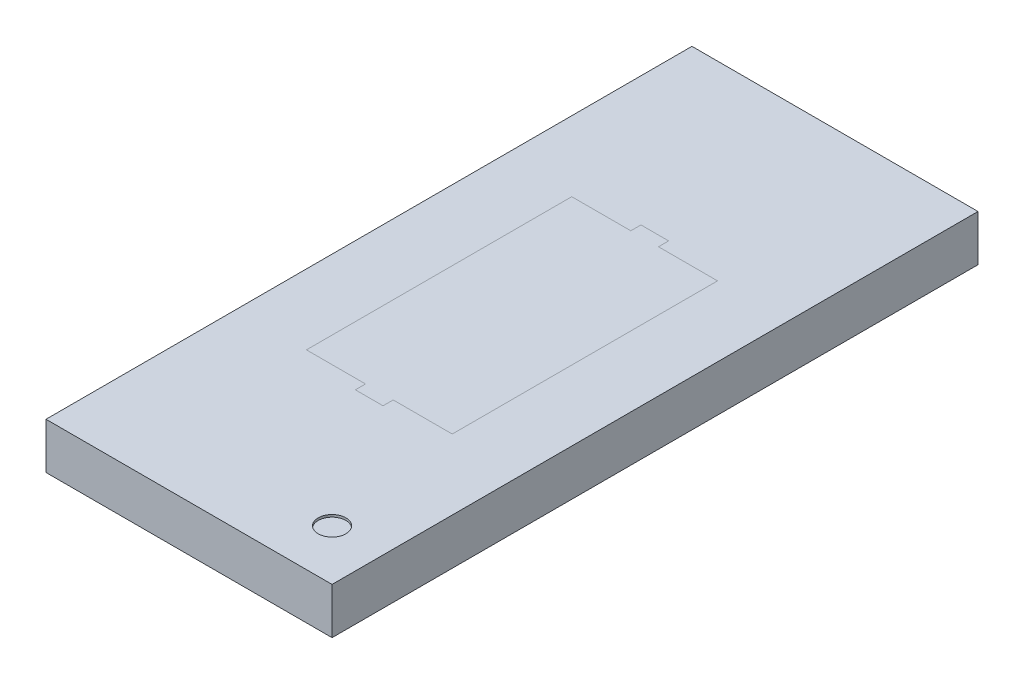
ISO-10303-21;
HEADER;
FILE_DESCRIPTION(('STEP AP214'),'2;1');
FILE_NAME('part.step','',(''),(''),'','','');
FILE_SCHEMA(('AUTOMOTIVE_DESIGN { 1 0 10303 214 1 1 1 1 }'));
ENDSEC;
DATA;
#1=APPLICATION_CONTEXT('core data for automotive mechanical design processes');
#2=APPLICATION_PROTOCOL_DEFINITION('international standard','automotive_design',2000,#1);
#3=PRODUCT_CONTEXT('',#1,'mechanical');
#4=PRODUCT('Part','Part','',(#3));
#5=PRODUCT_RELATED_PRODUCT_CATEGORY('part','',(#4));
#6=PRODUCT_DEFINITION_FORMATION('','',#4);
#7=PRODUCT_DEFINITION_CONTEXT('part definition',#1,'design');
#8=PRODUCT_DEFINITION('design','',#6,#7);
#9=PRODUCT_DEFINITION_SHAPE('','',#8);
#10=(LENGTH_UNIT() NAMED_UNIT(*) SI_UNIT(.MILLI.,.METRE.));
#11=(NAMED_UNIT(*) PLANE_ANGLE_UNIT() SI_UNIT($,.RADIAN.));
#12=(NAMED_UNIT(*) SI_UNIT($,.STERADIAN.) SOLID_ANGLE_UNIT());
#13=UNCERTAINTY_MEASURE_WITH_UNIT(LENGTH_MEASURE(1.E-05),#10,'distance_accuracy_value','');
#14=(GEOMETRIC_REPRESENTATION_CONTEXT(3) GLOBAL_UNCERTAINTY_ASSIGNED_CONTEXT((#13)) GLOBAL_UNIT_ASSIGNED_CONTEXT((#10,
#11,#12)) REPRESENTATION_CONTEXT('',''));
#15=CARTESIAN_POINT('',(0.,0.,0.));
#16=DIRECTION('',(0.,0.,1.));
#17=DIRECTION('',(1.,0.,0.));
#18=AXIS2_PLACEMENT_3D('',#15,#16,#17);
#19=CARTESIAN_POINT('',(1.58,1.,-2.875));
#20=DIRECTION('',(0.,-1.,0.));
#21=DIRECTION('',(0.,0.,-1.));
#22=AXIS2_PLACEMENT_3D('',#19,#20,#21);
#23=PLANE('',#22);
#24=DIRECTION('',(1.,0.,0.));
#25=VECTOR('',#24,1.);
#26=CARTESIAN_POINT('',(1.58,1.,-2.875));
#27=LINE('',#26,#25);
#28=CARTESIAN_POINT('',(0.3,1.,-2.875));
#29=VERTEX_POINT('',#28);
#30=CARTESIAN_POINT('',(1.58,1.,-2.875));
#31=VERTEX_POINT('',#30);
#32=EDGE_CURVE('P0_E134',#29,#31,#27,.T.);
#33=ORIENTED_EDGE('',*,*,#32,.F.);
#34=DIRECTION('',(0.,0.,-1.));
#35=VECTOR('',#34,1.);
#36=CARTESIAN_POINT('',(0.3,1.,-2.875));
#37=LINE('',#36,#35);
#38=CARTESIAN_POINT('',(0.3,1.,-3.095));
#39=VERTEX_POINT('',#38);
#40=EDGE_CURVE('P0_E131',#29,#39,#37,.T.);
#41=ORIENTED_EDGE('',*,*,#40,.T.);
#42=DIRECTION('',(-1.,0.,0.));
#43=VECTOR('',#42,1.);
#44=CARTESIAN_POINT('',(-0.3,1.,-3.095));
#45=LINE('',#44,#43);
#46=CARTESIAN_POINT('',(-0.3,1.,-3.095));
#47=VERTEX_POINT('',#46);
#48=EDGE_CURVE('P0_E128',#39,#47,#45,.T.);
#49=ORIENTED_EDGE('',*,*,#48,.T.);
#50=DIRECTION('',(0.,0.,1.));
#51=VECTOR('',#50,1.);
#52=CARTESIAN_POINT('',(-0.3,1.,-2.875));
#53=LINE('',#52,#51);
#54=CARTESIAN_POINT('',(-0.3,1.,-2.875));
#55=VERTEX_POINT('',#54);
#56=EDGE_CURVE('P0_E151',#47,#55,#53,.T.);
#57=ORIENTED_EDGE('',*,*,#56,.T.);
#58=DIRECTION('',(-1.,0.,0.));
#59=VECTOR('',#58,1.);
#60=CARTESIAN_POINT('',(-1.58,1.,-2.875));
#61=LINE('',#60,#59);
#62=CARTESIAN_POINT('',(-1.58,1.,-2.875));
#63=VERTEX_POINT('',#62);
#64=EDGE_CURVE('P0_E231',#55,#63,#61,.T.);
#65=ORIENTED_EDGE('',*,*,#64,.T.);
#66=DIRECTION('',(0.,0.,1.));
#67=VECTOR('',#66,1.);
#68=CARTESIAN_POINT('',(-1.58,1.,2.875));
#69=LINE('',#68,#67);
#70=CARTESIAN_POINT('',(-1.58,1.,2.875));
#71=VERTEX_POINT('',#70);
#72=EDGE_CURVE('P0_E226',#63,#71,#69,.T.);
#73=ORIENTED_EDGE('',*,*,#72,.T.);
#74=DIRECTION('',(1.,0.,0.));
#75=VECTOR('',#74,1.);
#76=CARTESIAN_POINT('',(-1.58,1.,2.875));
#77=LINE('',#76,#75);
#78=CARTESIAN_POINT('',(-0.3,1.,2.875));
#79=VERTEX_POINT('',#78);
#80=EDGE_CURVE('P0_E221',#71,#79,#77,.T.);
#81=ORIENTED_EDGE('',*,*,#80,.T.);
#82=DIRECTION('',(0.,0.,1.));
#83=VECTOR('',#82,1.);
#84=CARTESIAN_POINT('',(-0.3,1.,2.875));
#85=LINE('',#84,#83);
#86=CARTESIAN_POINT('',(-0.3,1.,3.095));
#87=VERTEX_POINT('',#86);
#88=EDGE_CURVE('P0_E216',#79,#87,#85,.T.);
#89=ORIENTED_EDGE('',*,*,#88,.T.);
#90=DIRECTION('',(1.,0.,0.));
#91=VECTOR('',#90,1.);
#92=CARTESIAN_POINT('',(-0.3,1.,3.095));
#93=LINE('',#92,#91);
#94=CARTESIAN_POINT('',(0.3,1.,3.095));
#95=VERTEX_POINT('',#94);
#96=EDGE_CURVE('P0_E211',#87,#95,#93,.T.);
#97=ORIENTED_EDGE('',*,*,#96,.T.);
#98=DIRECTION('',(0.,0.,-1.));
#99=VECTOR('',#98,1.);
#100=CARTESIAN_POINT('',(0.3,1.,2.875));
#101=LINE('',#100,#99);
#102=CARTESIAN_POINT('',(0.3,1.,2.875));
#103=VERTEX_POINT('',#102);
#104=EDGE_CURVE('P0_E206',#95,#103,#101,.T.);
#105=ORIENTED_EDGE('',*,*,#104,.T.);
#106=DIRECTION('',(1.,0.,0.));
#107=VECTOR('',#106,1.);
#108=CARTESIAN_POINT('',(0.3,1.,2.875));
#109=LINE('',#108,#107);
#110=CARTESIAN_POINT('',(1.58,1.,2.875));
#111=VERTEX_POINT('',#110);
#112=EDGE_CURVE('P0_E201',#103,#111,#109,.T.);
#113=ORIENTED_EDGE('',*,*,#112,.T.);
#114=DIRECTION('',(0.,0.,-1.));
#115=VECTOR('',#114,1.);
#116=CARTESIAN_POINT('',(1.58,1.,2.875));
#117=LINE('',#116,#115);
#118=EDGE_CURVE('P0_E196',#111,#31,#117,.T.);
#119=ORIENTED_EDGE('',*,*,#118,.T.);
#120=EDGE_LOOP('',(#33,#41,#49,#57,#65,#73,#81,#89,#97,#105,#113,#119));
#121=FACE_BOUND('',#120,.T.);
#122=ADVANCED_FACE('P0_F17',(#121),#23,.F.);
#123=CARTESIAN_POINT('',(2.,1.05,5.9));
#124=DIRECTION('',(0.,1.,0.));
#125=DIRECTION('',(0.,0.,1.));
#126=AXIS2_PLACEMENT_3D('',#123,#124,#125);
#127=PLANE('',#126);
#128=CARTESIAN_POINT('',(2.,1.05,5.9));
#129=DIRECTION('',(0.,1.,0.));
#130=DIRECTION('',(0.,0.,1.));
#131=AXIS2_PLACEMENT_3D('',#128,#129,#130);
#132=CIRCLE('',#131,0.3);
#133=CARTESIAN_POINT('',(2.,1.05,6.2));
#134=VERTEX_POINT('',#133);
#135=EDGE_CURVE('P0_E20',#134,#134,#132,.T.);
#136=ORIENTED_EDGE('',*,*,#135,.T.);
#137=EDGE_LOOP('',(#136));
#138=FACE_BOUND('',#137,.T.);
#139=ADVANCED_FACE('P0_F361',(#138),#127,.T.);
#140=CARTESIAN_POINT('',(0.3,1.,-2.875));
#141=DIRECTION('',(1.,0.,0.));
#142=DIRECTION('',(0.,0.,-1.));
#143=AXIS2_PLACEMENT_3D('',#140,#141,#142);
#144=PLANE('',#143);
#145=DIRECTION('',(0.,1.,0.));
#146=VECTOR('',#145,1.);
#147=CARTESIAN_POINT('',(0.3,1.,-3.095));
#148=LINE('',#147,#146);
#149=CARTESIAN_POINT('',(0.3,1.1,-3.095));
#150=VERTEX_POINT('',#149);
#151=EDGE_CURVE('P0_E137',#150,#39,#148,.F.);
#152=ORIENTED_EDGE('',*,*,#151,.T.);
#153=ORIENTED_EDGE('',*,*,#40,.F.);
#154=DIRECTION('',(0.,1.,0.));
#155=VECTOR('',#154,1.);
#156=CARTESIAN_POINT('',(0.3,1.,-2.875));
#157=LINE('',#156,#155);
#158=CARTESIAN_POINT('',(0.3,1.1,-2.875));
#159=VERTEX_POINT('',#158);
#160=EDGE_CURVE('P0_E191',#29,#159,#157,.T.);
#161=ORIENTED_EDGE('',*,*,#160,.T.);
#162=DIRECTION('',(0.,0.,-1.));
#163=VECTOR('',#162,1.);
#164=CARTESIAN_POINT('',(0.3,1.1,-7.));
#165=LINE('',#164,#163);
#166=EDGE_CURVE('P0_E142',#159,#150,#165,.T.);
#167=ORIENTED_EDGE('',*,*,#166,.T.);
#168=EDGE_LOOP('',(#152,#153,#161,#167));
#169=FACE_BOUND('',#168,.T.);
#170=ADVANCED_FACE('P0_F140',(#169),#144,.F.);
#171=CARTESIAN_POINT('',(-0.3,1.,-3.095));
#172=DIRECTION('',(0.,0.,-1.));
#173=DIRECTION('',(-1.,0.,0.));
#174=AXIS2_PLACEMENT_3D('',#171,#172,#173);
#175=PLANE('',#174);
#176=DIRECTION('',(0.,1.,0.));
#177=VECTOR('',#176,1.);
#178=CARTESIAN_POINT('',(-0.3,1.,-3.095));
#179=LINE('',#178,#177);
#180=CARTESIAN_POINT('',(-0.3,1.1,-3.095));
#181=VERTEX_POINT('',#180);
#182=EDGE_CURVE('P0_E148',#181,#47,#179,.F.);
#183=ORIENTED_EDGE('',*,*,#182,.T.);
#184=ORIENTED_EDGE('',*,*,#48,.F.);
#185=ORIENTED_EDGE('',*,*,#151,.F.);
#186=DIRECTION('',(1.,0.,0.));
#187=VECTOR('',#186,1.);
#188=CARTESIAN_POINT('',(3.1,1.1,-3.095));
#189=LINE('',#188,#187);
#190=EDGE_CURVE('P0_E188',#150,#181,#189,.F.);
#191=ORIENTED_EDGE('',*,*,#190,.T.);
#192=EDGE_LOOP('',(#183,#184,#185,#191));
#193=FACE_BOUND('',#192,.T.);
#194=ADVANCED_FACE('P0_F146',(#193),#175,.F.);
#195=CARTESIAN_POINT('',(-0.3,1.,-2.875));
#196=DIRECTION('',(-1.,0.,0.));
#197=DIRECTION('',(0.,0.,1.));
#198=AXIS2_PLACEMENT_3D('',#195,#196,#197);
#199=PLANE('',#198);
#200=DIRECTION('',(0.,1.,0.));
#201=VECTOR('',#200,1.);
#202=CARTESIAN_POINT('',(-0.3,1.,-2.875));
#203=LINE('',#202,#201);
#204=CARTESIAN_POINT('',(-0.3,1.1,-2.875));
#205=VERTEX_POINT('',#204);
#206=EDGE_CURVE('P0_E233',#205,#55,#203,.F.);
#207=ORIENTED_EDGE('',*,*,#206,.T.);
#208=ORIENTED_EDGE('',*,*,#56,.F.);
#209=ORIENTED_EDGE('',*,*,#182,.F.);
#210=DIRECTION('',(0.,0.,-1.));
#211=VECTOR('',#210,1.);
#212=CARTESIAN_POINT('',(-0.3,1.1,-7.));
#213=LINE('',#212,#211);
#214=EDGE_CURVE('P0_E186',#181,#205,#213,.F.);
#215=ORIENTED_EDGE('',*,*,#214,.T.);
#216=EDGE_LOOP('',(#207,#208,#209,#215));
#217=FACE_BOUND('',#216,.T.);
#218=ADVANCED_FACE('P0_F238',(#217),#199,.F.);
#219=CARTESIAN_POINT('',(-1.58,1.,-2.875));
#220=DIRECTION('',(0.,0.,-1.));
#221=DIRECTION('',(-1.,0.,0.));
#222=AXIS2_PLACEMENT_3D('',#219,#220,#221);
#223=PLANE('',#222);
#224=DIRECTION('',(0.,1.,0.));
#225=VECTOR('',#224,1.);
#226=CARTESIAN_POINT('',(-1.58,1.,-2.875));
#227=LINE('',#226,#225);
#228=CARTESIAN_POINT('',(-1.58,1.1,-2.875));
#229=VERTEX_POINT('',#228);
#230=EDGE_CURVE('P0_E228',#229,#63,#227,.F.);
#231=ORIENTED_EDGE('',*,*,#230,.T.);
#232=ORIENTED_EDGE('',*,*,#64,.F.);
#233=ORIENTED_EDGE('',*,*,#206,.F.);
#234=DIRECTION('',(1.,0.,0.));
#235=VECTOR('',#234,1.);
#236=CARTESIAN_POINT('',(3.1,1.1,-2.875));
#237=LINE('',#236,#235);
#238=EDGE_CURVE('P0_E184',#205,#229,#237,.F.);
#239=ORIENTED_EDGE('',*,*,#238,.T.);
#240=EDGE_LOOP('',(#231,#232,#233,#239));
#241=FACE_BOUND('',#240,.T.);
#242=ADVANCED_FACE('P0_F242',(#241),#223,.F.);
#243=CARTESIAN_POINT('',(-1.58,1.,2.875));
#244=DIRECTION('',(-1.,0.,0.));
#245=DIRECTION('',(0.,0.,1.));
#246=AXIS2_PLACEMENT_3D('',#243,#244,#245);
#247=PLANE('',#246);
#248=DIRECTION('',(0.,1.,0.));
#249=VECTOR('',#248,1.);
#250=CARTESIAN_POINT('',(-1.58,1.,2.875));
#251=LINE('',#250,#249);
#252=CARTESIAN_POINT('',(-1.58,1.1,2.875));
#253=VERTEX_POINT('',#252);
#254=EDGE_CURVE('P0_E223',#253,#71,#251,.F.);
#255=ORIENTED_EDGE('',*,*,#254,.T.);
#256=ORIENTED_EDGE('',*,*,#72,.F.);
#257=ORIENTED_EDGE('',*,*,#230,.F.);
#258=DIRECTION('',(0.,0.,-1.));
#259=VECTOR('',#258,1.);
#260=CARTESIAN_POINT('',(-1.58,1.1,-7.));
#261=LINE('',#260,#259);
#262=EDGE_CURVE('P0_E182',#229,#253,#261,.F.);
#263=ORIENTED_EDGE('',*,*,#262,.T.);
#264=EDGE_LOOP('',(#255,#256,#257,#263));
#265=FACE_BOUND('',#264,.T.);
#266=ADVANCED_FACE('P0_F247',(#265),#247,.F.);
#267=CARTESIAN_POINT('',(-1.58,1.,2.875));
#268=DIRECTION('',(0.,0.,1.));
#269=DIRECTION('',(1.,0.,0.));
#270=AXIS2_PLACEMENT_3D('',#267,#268,#269);
#271=PLANE('',#270);
#272=DIRECTION('',(0.,1.,0.));
#273=VECTOR('',#272,1.);
#274=CARTESIAN_POINT('',(-0.3,1.,2.875));
#275=LINE('',#274,#273);
#276=CARTESIAN_POINT('',(-0.3,1.1,2.875));
#277=VERTEX_POINT('',#276);
#278=EDGE_CURVE('P0_E218',#277,#79,#275,.F.);
#279=ORIENTED_EDGE('',*,*,#278,.T.);
#280=ORIENTED_EDGE('',*,*,#80,.F.);
#281=ORIENTED_EDGE('',*,*,#254,.F.);
#282=DIRECTION('',(1.,0.,0.));
#283=VECTOR('',#282,1.);
#284=CARTESIAN_POINT('',(3.1,1.1,2.875));
#285=LINE('',#284,#283);
#286=EDGE_CURVE('P0_E180',#253,#277,#285,.T.);
#287=ORIENTED_EDGE('',*,*,#286,.T.);
#288=EDGE_LOOP('',(#279,#280,#281,#287));
#289=FACE_BOUND('',#288,.T.);
#290=ADVANCED_FACE('P0_F253',(#289),#271,.F.);
#291=CARTESIAN_POINT('',(-0.3,1.,2.875));
#292=DIRECTION('',(-1.,0.,0.));
#293=DIRECTION('',(0.,0.,1.));
#294=AXIS2_PLACEMENT_3D('',#291,#292,#293);
#295=PLANE('',#294);
#296=DIRECTION('',(0.,1.,0.));
#297=VECTOR('',#296,1.);
#298=CARTESIAN_POINT('',(-0.3,1.,3.095));
#299=LINE('',#298,#297);
#300=CARTESIAN_POINT('',(-0.3,1.1,3.095));
#301=VERTEX_POINT('',#300);
#302=EDGE_CURVE('P0_E213',#301,#87,#299,.F.);
#303=ORIENTED_EDGE('',*,*,#302,.T.);
#304=ORIENTED_EDGE('',*,*,#88,.F.);
#305=ORIENTED_EDGE('',*,*,#278,.F.);
#306=DIRECTION('',(0.,0.,-1.));
#307=VECTOR('',#306,1.);
#308=CARTESIAN_POINT('',(-0.3,1.1,-7.));
#309=LINE('',#308,#307);
#310=EDGE_CURVE('P0_E178',#277,#301,#309,.F.);
#311=ORIENTED_EDGE('',*,*,#310,.T.);
#312=EDGE_LOOP('',(#303,#304,#305,#311));
#313=FACE_BOUND('',#312,.T.);
#314=ADVANCED_FACE('P0_F257',(#313),#295,.F.);
#315=CARTESIAN_POINT('',(-0.3,1.,3.095));
#316=DIRECTION('',(0.,0.,1.));
#317=DIRECTION('',(1.,0.,0.));
#318=AXIS2_PLACEMENT_3D('',#315,#316,#317);
#319=PLANE('',#318);
#320=DIRECTION('',(0.,1.,0.));
#321=VECTOR('',#320,1.);
#322=CARTESIAN_POINT('',(0.3,1.,3.095));
#323=LINE('',#322,#321);
#324=CARTESIAN_POINT('',(0.3,1.1,3.095));
#325=VERTEX_POINT('',#324);
#326=EDGE_CURVE('P0_E208',#325,#95,#323,.F.);
#327=ORIENTED_EDGE('',*,*,#326,.T.);
#328=ORIENTED_EDGE('',*,*,#96,.F.);
#329=ORIENTED_EDGE('',*,*,#302,.F.);
#330=DIRECTION('',(1.,0.,0.));
#331=VECTOR('',#330,1.);
#332=CARTESIAN_POINT('',(3.1,1.1,3.095));
#333=LINE('',#332,#331);
#334=EDGE_CURVE('P0_E176',#301,#325,#333,.T.);
#335=ORIENTED_EDGE('',*,*,#334,.T.);
#336=EDGE_LOOP('',(#327,#328,#329,#335));
#337=FACE_BOUND('',#336,.T.);
#338=ADVANCED_FACE('P0_F262',(#337),#319,.F.);
#339=CARTESIAN_POINT('',(0.3,1.,2.875));
#340=DIRECTION('',(1.,0.,0.));
#341=DIRECTION('',(0.,0.,-1.));
#342=AXIS2_PLACEMENT_3D('',#339,#340,#341);
#343=PLANE('',#342);
#344=DIRECTION('',(0.,1.,0.));
#345=VECTOR('',#344,1.);
#346=CARTESIAN_POINT('',(0.3,1.,2.875));
#347=LINE('',#346,#345);
#348=CARTESIAN_POINT('',(0.3,1.1,2.875));
#349=VERTEX_POINT('',#348);
#350=EDGE_CURVE('P0_E203',#349,#103,#347,.F.);
#351=ORIENTED_EDGE('',*,*,#350,.T.);
#352=ORIENTED_EDGE('',*,*,#104,.F.);
#353=ORIENTED_EDGE('',*,*,#326,.F.);
#354=DIRECTION('',(0.,0.,-1.));
#355=VECTOR('',#354,1.);
#356=CARTESIAN_POINT('',(0.3,1.1,-7.));
#357=LINE('',#356,#355);
#358=EDGE_CURVE('P0_E174',#325,#349,#357,.T.);
#359=ORIENTED_EDGE('',*,*,#358,.T.);
#360=EDGE_LOOP('',(#351,#352,#353,#359));
#361=FACE_BOUND('',#360,.T.);
#362=ADVANCED_FACE('P0_F268',(#361),#343,.F.);
#363=CARTESIAN_POINT('',(0.3,1.,2.875));
#364=DIRECTION('',(0.,0.,1.));
#365=DIRECTION('',(1.,0.,0.));
#366=AXIS2_PLACEMENT_3D('',#363,#364,#365);
#367=PLANE('',#366);
#368=DIRECTION('',(0.,1.,0.));
#369=VECTOR('',#368,1.);
#370=CARTESIAN_POINT('',(1.58,1.,2.875));
#371=LINE('',#370,#369);
#372=CARTESIAN_POINT('',(1.58,1.1,2.875));
#373=VERTEX_POINT('',#372);
#374=EDGE_CURVE('P0_E198',#373,#111,#371,.F.);
#375=ORIENTED_EDGE('',*,*,#374,.T.);
#376=ORIENTED_EDGE('',*,*,#112,.F.);
#377=ORIENTED_EDGE('',*,*,#350,.F.);
#378=DIRECTION('',(1.,0.,0.));
#379=VECTOR('',#378,1.);
#380=CARTESIAN_POINT('',(3.1,1.1,2.875));
#381=LINE('',#380,#379);
#382=EDGE_CURVE('P0_E169',#349,#373,#381,.T.);
#383=ORIENTED_EDGE('',*,*,#382,.T.);
#384=EDGE_LOOP('',(#375,#376,#377,#383));
#385=FACE_BOUND('',#384,.T.);
#386=ADVANCED_FACE('P0_F272',(#385),#367,.F.);
#387=CARTESIAN_POINT('',(1.58,1.,2.875));
#388=DIRECTION('',(1.,0.,0.));
#389=DIRECTION('',(0.,0.,-1.));
#390=AXIS2_PLACEMENT_3D('',#387,#388,#389);
#391=PLANE('',#390);
#392=DIRECTION('',(0.,1.,0.));
#393=VECTOR('',#392,1.);
#394=CARTESIAN_POINT('',(1.58,1.,-2.875));
#395=LINE('',#394,#393);
#396=CARTESIAN_POINT('',(1.58,1.1,-2.875));
#397=VERTEX_POINT('',#396);
#398=EDGE_CURVE('P0_E193',#397,#31,#395,.F.);
#399=ORIENTED_EDGE('',*,*,#398,.T.);
#400=ORIENTED_EDGE('',*,*,#118,.F.);
#401=ORIENTED_EDGE('',*,*,#374,.F.);
#402=DIRECTION('',(0.,0.,-1.));
#403=VECTOR('',#402,1.);
#404=CARTESIAN_POINT('',(1.58,1.1,-7.));
#405=LINE('',#404,#403);
#406=EDGE_CURVE('P0_E164',#373,#397,#405,.T.);
#407=ORIENTED_EDGE('',*,*,#406,.T.);
#408=EDGE_LOOP('',(#399,#400,#401,#407));
#409=FACE_BOUND('',#408,.T.);
#410=ADVANCED_FACE('P0_F277',(#409),#391,.F.);
#411=CARTESIAN_POINT('',(0.3,1.,-2.875));
#412=DIRECTION('',(0.,0.,-1.));
#413=DIRECTION('',(-1.,0.,0.));
#414=AXIS2_PLACEMENT_3D('',#411,#412,#413);
#415=PLANE('',#414);
#416=ORIENTED_EDGE('',*,*,#160,.F.);
#417=ORIENTED_EDGE('',*,*,#32,.T.);
#418=ORIENTED_EDGE('',*,*,#398,.F.);
#419=DIRECTION('',(1.,0.,0.));
#420=VECTOR('',#419,1.);
#421=CARTESIAN_POINT('',(3.1,1.1,-2.875));
#422=LINE('',#421,#420);
#423=EDGE_CURVE('P0_E158',#397,#159,#422,.F.);
#424=ORIENTED_EDGE('',*,*,#423,.T.);
#425=EDGE_LOOP('',(#416,#417,#418,#424));
#426=FACE_BOUND('',#425,.T.);
#427=ADVANCED_FACE('P0_F278',(#426),#415,.F.);
#428=CARTESIAN_POINT('',(2.,1.05,5.9));
#429=DIRECTION('',(0.,1.,0.));
#430=DIRECTION('',(0.,0.,1.));
#431=AXIS2_PLACEMENT_3D('',#428,#429,#430);
#432=CYLINDRICAL_SURFACE('',#431,0.3);
#433=CARTESIAN_POINT('',(2.,1.1,5.9));
#434=DIRECTION('',(0.,1.,0.));
#435=DIRECTION('',(0.,0.,1.));
#436=AXIS2_PLACEMENT_3D('',#433,#434,#435);
#437=CIRCLE('',#436,0.3);
#438=CARTESIAN_POINT('',(2.,1.1,6.2));
#439=VERTEX_POINT('',#438);
#440=EDGE_CURVE('P0_E155',#439,#439,#437,.T.);
#441=ORIENTED_EDGE('',*,*,#440,.T.);
#442=EDGE_LOOP('',(#441));
#443=FACE_BOUND('',#442,.T.);
#444=ORIENTED_EDGE('',*,*,#135,.F.);
#445=EDGE_LOOP('',(#444));
#446=FACE_BOUND('',#445,.T.);
#447=ADVANCED_FACE('P0_F284',(#443,#446),#432,.F.);
#448=CARTESIAN_POINT('',(3.1,1.1,-7.));
#449=DIRECTION('',(0.,-1.,0.));
#450=DIRECTION('',(0.,0.,-1.));
#451=AXIS2_PLACEMENT_3D('',#448,#449,#450);
#452=PLANE('',#451);
#453=ORIENTED_EDGE('',*,*,#440,.F.);
#454=EDGE_LOOP('',(#453));
#455=FACE_BOUND('',#454,.T.);
#456=ORIENTED_EDGE('',*,*,#406,.F.);
#457=ORIENTED_EDGE('',*,*,#382,.F.);
#458=ORIENTED_EDGE('',*,*,#358,.F.);
#459=ORIENTED_EDGE('',*,*,#334,.F.);
#460=ORIENTED_EDGE('',*,*,#310,.F.);
#461=ORIENTED_EDGE('',*,*,#286,.F.);
#462=ORIENTED_EDGE('',*,*,#262,.F.);
#463=ORIENTED_EDGE('',*,*,#238,.F.);
#464=ORIENTED_EDGE('',*,*,#214,.F.);
#465=ORIENTED_EDGE('',*,*,#190,.F.);
#466=ORIENTED_EDGE('',*,*,#166,.F.);
#467=ORIENTED_EDGE('',*,*,#423,.F.);
#468=EDGE_LOOP('',(#456,#457,#458,#459,#460,#461,#462,#463,#464,#465,#466,#467));
#469=FACE_BOUND('',#468,.T.);
#470=DIRECTION('',(1.,0.,0.));
#471=VECTOR('',#470,1.);
#472=CARTESIAN_POINT('',(-3.1,1.1,-7.));
#473=LINE('',#472,#471);
#474=CARTESIAN_POINT('',(3.1,1.1,-7.));
#475=VERTEX_POINT('',#474);
#476=CARTESIAN_POINT('',(-3.1,1.1,-7.));
#477=VERTEX_POINT('',#476);
#478=EDGE_CURVE('P0_E288',#475,#477,#473,.F.);
#479=ORIENTED_EDGE('',*,*,#478,.T.);
#480=DIRECTION('',(0.,0.,-1.));
#481=VECTOR('',#480,1.);
#482=CARTESIAN_POINT('',(-3.1,1.1,7.));
#483=LINE('',#482,#481);
#484=CARTESIAN_POINT('',(-3.1,1.1,7.));
#485=VERTEX_POINT('',#484);
#486=EDGE_CURVE('P0_E289',#477,#485,#483,.F.);
#487=ORIENTED_EDGE('',*,*,#486,.T.);
#488=DIRECTION('',(-1.,0.,0.));
#489=VECTOR('',#488,1.);
#490=CARTESIAN_POINT('',(-3.1,1.1,7.));
#491=LINE('',#490,#489);
#492=CARTESIAN_POINT('',(3.1,1.1,7.));
#493=VERTEX_POINT('',#492);
#494=EDGE_CURVE('P0_E161',#485,#493,#491,.F.);
#495=ORIENTED_EDGE('',*,*,#494,.T.);
#496=DIRECTION('',(0.,0.,1.));
#497=VECTOR('',#496,1.);
#498=CARTESIAN_POINT('',(3.1,1.1,7.));
#499=LINE('',#498,#497);
#500=EDGE_CURVE('P0_E157',#493,#475,#499,.F.);
#501=ORIENTED_EDGE('',*,*,#500,.T.);
#502=EDGE_LOOP('',(#479,#487,#495,#501));
#503=FACE_BOUND('',#502,.T.);
#504=ADVANCED_FACE('P0_F280',(#455,#469,#503),#452,.F.);
#505=CARTESIAN_POINT('',(3.1,1.1,7.));
#506=DIRECTION('',(-1.,0.,0.));
#507=DIRECTION('',(0.,0.,1.));
#508=AXIS2_PLACEMENT_3D('',#505,#506,#507);
#509=PLANE('',#508);
#510=DIRECTION('',(0.,1.,0.));
#511=VECTOR('',#510,1.);
#512=CARTESIAN_POINT('',(3.1,1.1,-7.));
#513=LINE('',#512,#511);
#514=CARTESIAN_POINT('',(3.1,0.1,-7.));
#515=VERTEX_POINT('',#514);
#516=EDGE_CURVE('P0_E295',#515,#475,#513,.T.);
#517=ORIENTED_EDGE('',*,*,#516,.T.);
#518=ORIENTED_EDGE('',*,*,#500,.F.);
#519=DIRECTION('',(0.,1.,0.));
#520=VECTOR('',#519,1.);
#521=CARTESIAN_POINT('',(3.1,1.1,7.));
#522=LINE('',#521,#520);
#523=CARTESIAN_POINT('',(3.1,0.1,7.));
#524=VERTEX_POINT('',#523);
#525=EDGE_CURVE('P0_E300',#493,#524,#522,.F.);
#526=ORIENTED_EDGE('',*,*,#525,.T.);
#527=DIRECTION('',(0.,0.,-1.));
#528=VECTOR('',#527,1.);
#529=CARTESIAN_POINT('',(3.1,0.1,-7.));
#530=LINE('',#529,#528);
#531=EDGE_CURVE('P0_E304',#515,#524,#530,.F.);
#532=ORIENTED_EDGE('',*,*,#531,.F.);
#533=EDGE_LOOP('',(#517,#518,#526,#532));
#534=FACE_BOUND('',#533,.T.);
#535=ADVANCED_FACE('P0_F283',(#534),#509,.F.);
#536=CARTESIAN_POINT('',(-3.1,1.1,7.));
#537=DIRECTION('',(0.,0.,-1.));
#538=DIRECTION('',(-1.,0.,0.));
#539=AXIS2_PLACEMENT_3D('',#536,#537,#538);
#540=PLANE('',#539);
#541=ORIENTED_EDGE('',*,*,#525,.F.);
#542=ORIENTED_EDGE('',*,*,#494,.F.);
#543=DIRECTION('',(0.,1.,0.));
#544=VECTOR('',#543,1.);
#545=CARTESIAN_POINT('',(-3.1,1.1,7.));
#546=LINE('',#545,#544);
#547=CARTESIAN_POINT('',(-3.1,0.1,7.));
#548=VERTEX_POINT('',#547);
#549=EDGE_CURVE('P0_E299',#485,#548,#546,.F.);
#550=ORIENTED_EDGE('',*,*,#549,.T.);
#551=DIRECTION('',(1.,0.,0.));
#552=VECTOR('',#551,1.);
#553=CARTESIAN_POINT('',(3.1,0.1,7.));
#554=LINE('',#553,#552);
#555=EDGE_CURVE('P0_E307',#524,#548,#554,.F.);
#556=ORIENTED_EDGE('',*,*,#555,.F.);
#557=EDGE_LOOP('',(#541,#542,#550,#556));
#558=FACE_BOUND('',#557,.T.);
#559=ADVANCED_FACE('P0_F317',(#558),#540,.F.);
#560=CARTESIAN_POINT('',(-3.1,1.1,7.));
#561=DIRECTION('',(1.,0.,0.));
#562=DIRECTION('',(0.,0.,-1.));
#563=AXIS2_PLACEMENT_3D('',#560,#561,#562);
#564=PLANE('',#563);
#565=ORIENTED_EDGE('',*,*,#549,.F.);
#566=ORIENTED_EDGE('',*,*,#486,.F.);
#567=DIRECTION('',(0.,1.,0.));
#568=VECTOR('',#567,1.);
#569=CARTESIAN_POINT('',(-3.1,1.1,-7.));
#570=LINE('',#569,#568);
#571=CARTESIAN_POINT('',(-3.1,0.1,-7.));
#572=VERTEX_POINT('',#571);
#573=EDGE_CURVE('P0_E35',#477,#572,#570,.F.);
#574=ORIENTED_EDGE('',*,*,#573,.T.);
#575=DIRECTION('',(0.,0.,-1.));
#576=VECTOR('',#575,1.);
#577=CARTESIAN_POINT('',(-3.1,0.1,-7.));
#578=LINE('',#577,#576);
#579=EDGE_CURVE('P0_E26',#548,#572,#578,.T.);
#580=ORIENTED_EDGE('',*,*,#579,.F.);
#581=EDGE_LOOP('',(#565,#566,#574,#580));
#582=FACE_BOUND('',#581,.T.);
#583=ADVANCED_FACE('P0_F298',(#582),#564,.F.);
#584=CARTESIAN_POINT('',(-3.1,1.1,-7.));
#585=DIRECTION('',(0.,0.,1.));
#586=DIRECTION('',(1.,0.,0.));
#587=AXIS2_PLACEMENT_3D('',#584,#585,#586);
#588=PLANE('',#587);
#589=ORIENTED_EDGE('',*,*,#573,.F.);
#590=ORIENTED_EDGE('',*,*,#478,.F.);
#591=ORIENTED_EDGE('',*,*,#516,.F.);
#592=DIRECTION('',(1.,0.,0.));
#593=VECTOR('',#592,1.);
#594=CARTESIAN_POINT('',(3.1,0.1,-7.));
#595=LINE('',#594,#593);
#596=EDGE_CURVE('P0_E11',#572,#515,#595,.T.);
#597=ORIENTED_EDGE('',*,*,#596,.F.);
#598=EDGE_LOOP('',(#589,#590,#591,#597));
#599=FACE_BOUND('',#598,.T.);
#600=ADVANCED_FACE('P0_F302',(#599),#588,.F.);
#601=CARTESIAN_POINT('',(3.1,0.1,-7.));
#602=DIRECTION('',(0.,-1.,0.));
#603=DIRECTION('',(0.,0.,-1.));
#604=AXIS2_PLACEMENT_3D('',#601,#602,#603);
#605=PLANE('',#604);
#606=ORIENTED_EDGE('',*,*,#579,.T.);
#607=ORIENTED_EDGE('',*,*,#596,.T.);
#608=ORIENTED_EDGE('',*,*,#531,.T.);
#609=ORIENTED_EDGE('',*,*,#555,.T.);
#610=EDGE_LOOP('',(#606,#607,#608,#609));
#611=FACE_BOUND('',#610,.T.);
#612=ADVANCED_FACE('P0_F320',(#611),#605,.T.);
#613=CLOSED_SHELL('',(#122,#139,#170,#194,#218,#242,#266,#290,#314,#338,#362,#386,#410,#427,
#447,#504,#535,#559,#583,#600,#612));
#614=MANIFOLD_SOLID_BREP('P0_B1',#613);
#615=CARTESIAN_POINT('',(1.58,1.1,-2.875));
#616=DIRECTION('',(0.,-1.,0.));
#617=DIRECTION('',(0.,0.,-1.));
#618=AXIS2_PLACEMENT_3D('',#615,#616,#617);
#619=PLANE('',#618);
#620=DIRECTION('',(1.,0.,0.));
#621=VECTOR('',#620,1.);
#622=CARTESIAN_POINT('',(1.58,1.1,-2.875));
#623=LINE('',#622,#621);
#624=CARTESIAN_POINT('',(0.3,1.1,-2.875));
#625=VERTEX_POINT('',#624);
#626=CARTESIAN_POINT('',(1.58,1.1,-2.875));
#627=VERTEX_POINT('',#626);
#628=EDGE_CURVE('P1_E129',#625,#627,#623,.T.);
#629=ORIENTED_EDGE('',*,*,#628,.F.);
#630=DIRECTION('',(0.,0.,-1.));
#631=VECTOR('',#630,1.);
#632=CARTESIAN_POINT('',(0.3,1.1,-2.875));
#633=LINE('',#632,#631);
#634=CARTESIAN_POINT('',(0.3,1.1,-3.095));
#635=VERTEX_POINT('',#634);
#636=EDGE_CURVE('P1_E125',#635,#625,#633,.F.);
#637=ORIENTED_EDGE('',*,*,#636,.F.);
#638=DIRECTION('',(1.,0.,0.));
#639=VECTOR('',#638,1.);
#640=CARTESIAN_POINT('',(1.58,1.1,-3.095));
#641=LINE('',#640,#639);
#642=CARTESIAN_POINT('',(-0.3,1.1,-3.095));
#643=VERTEX_POINT('',#642);
#644=EDGE_CURVE('P1_E124',#643,#635,#641,.T.);
#645=ORIENTED_EDGE('',*,*,#644,.F.);
#646=DIRECTION('',(0.,0.,-1.));
#647=VECTOR('',#646,1.);
#648=CARTESIAN_POINT('',(-0.3,1.1,-2.875));
#649=LINE('',#648,#647);
#650=CARTESIAN_POINT('',(-0.3,1.1,-2.875));
#651=VERTEX_POINT('',#650);
#652=EDGE_CURVE('P1_E103',#651,#643,#649,.T.);
#653=ORIENTED_EDGE('',*,*,#652,.F.);
#654=DIRECTION('',(1.,0.,0.));
#655=VECTOR('',#654,1.);
#656=CARTESIAN_POINT('',(1.58,1.1,-2.875));
#657=LINE('',#656,#655);
#658=CARTESIAN_POINT('',(-1.58,1.1,-2.875));
#659=VERTEX_POINT('',#658);
#660=EDGE_CURVE('P1_E20',#659,#651,#657,.T.);
#661=ORIENTED_EDGE('',*,*,#660,.F.);
#662=DIRECTION('',(0.,0.,1.));
#663=VECTOR('',#662,1.);
#664=CARTESIAN_POINT('',(-1.58,1.1,2.875));
#665=LINE('',#664,#663);
#666=CARTESIAN_POINT('',(-1.58,1.1,2.875));
#667=VERTEX_POINT('',#666);
#668=EDGE_CURVE('P1_E164',#667,#659,#665,.F.);
#669=ORIENTED_EDGE('',*,*,#668,.F.);
#670=DIRECTION('',(1.,0.,0.));
#671=VECTOR('',#670,1.);
#672=CARTESIAN_POINT('',(-1.58,1.1,2.875));
#673=LINE('',#672,#671);
#674=CARTESIAN_POINT('',(-0.3,1.1,2.875));
#675=VERTEX_POINT('',#674);
#676=EDGE_CURVE('P1_E158',#675,#667,#673,.F.);
#677=ORIENTED_EDGE('',*,*,#676,.F.);
#678=DIRECTION('',(0.,0.,1.));
#679=VECTOR('',#678,1.);
#680=CARTESIAN_POINT('',(-0.3,1.1,2.875));
#681=LINE('',#680,#679);
#682=CARTESIAN_POINT('',(-0.3,1.1,3.095));
#683=VERTEX_POINT('',#682);
#684=EDGE_CURVE('P1_E152',#683,#675,#681,.F.);
#685=ORIENTED_EDGE('',*,*,#684,.F.);
#686=DIRECTION('',(1.,0.,0.));
#687=VECTOR('',#686,1.);
#688=CARTESIAN_POINT('',(-0.3,1.1,3.095));
#689=LINE('',#688,#687);
#690=CARTESIAN_POINT('',(0.3,1.1,3.095));
#691=VERTEX_POINT('',#690);
#692=EDGE_CURVE('P1_E146',#691,#683,#689,.F.);
#693=ORIENTED_EDGE('',*,*,#692,.F.);
#694=DIRECTION('',(0.,0.,-1.));
#695=VECTOR('',#694,1.);
#696=CARTESIAN_POINT('',(0.3,1.1,2.875));
#697=LINE('',#696,#695);
#698=CARTESIAN_POINT('',(0.3,1.1,2.875));
#699=VERTEX_POINT('',#698);
#700=EDGE_CURVE('P1_E140',#699,#691,#697,.F.);
#701=ORIENTED_EDGE('',*,*,#700,.F.);
#702=DIRECTION('',(1.,0.,0.));
#703=VECTOR('',#702,1.);
#704=CARTESIAN_POINT('',(0.3,1.1,2.875));
#705=LINE('',#704,#703);
#706=CARTESIAN_POINT('',(1.58,1.1,2.875));
#707=VERTEX_POINT('',#706);
#708=EDGE_CURVE('P1_E134',#707,#699,#705,.F.);
#709=ORIENTED_EDGE('',*,*,#708,.F.);
#710=DIRECTION('',(0.,0.,-1.));
#711=VECTOR('',#710,1.);
#712=CARTESIAN_POINT('',(1.58,1.1,2.875));
#713=LINE('',#712,#711);
#714=EDGE_CURVE('P1_E131',#627,#707,#713,.F.);
#715=ORIENTED_EDGE('',*,*,#714,.F.);
#716=EDGE_LOOP('',(#629,#637,#645,#653,#661,#669,#677,#685,#693,#701,#709,#715));
#717=FACE_BOUND('',#716,.T.);
#718=ADVANCED_FACE('P1_F17',(#717),#619,.F.);
#719=CARTESIAN_POINT('',(1.58,1.,2.875));
#720=DIRECTION('',(1.,0.,0.));
#721=DIRECTION('',(0.,0.,-1.));
#722=AXIS2_PLACEMENT_3D('',#719,#720,#721);
#723=PLANE('',#722);
#724=DIRECTION('',(0.,0.,-1.));
#725=VECTOR('',#724,1.);
#726=CARTESIAN_POINT('',(1.58,1.,-2.875));
#727=LINE('',#726,#725);
#728=CARTESIAN_POINT('',(1.58,1.,-2.875));
#729=VERTEX_POINT('',#728);
#730=CARTESIAN_POINT('',(1.58,1.,2.875));
#731=VERTEX_POINT('',#730);
#732=EDGE_CURVE('P1_E178',#729,#731,#727,.F.);
#733=ORIENTED_EDGE('',*,*,#732,.F.);
#734=DIRECTION('',(0.,1.,0.));
#735=VECTOR('',#734,1.);
#736=CARTESIAN_POINT('',(1.58,1.,-2.875));
#737=LINE('',#736,#735);
#738=EDGE_CURVE('P1_E174',#627,#729,#737,.F.);
#739=ORIENTED_EDGE('',*,*,#738,.F.);
#740=ORIENTED_EDGE('',*,*,#714,.T.);
#741=DIRECTION('',(0.,1.,0.));
#742=VECTOR('',#741,1.);
#743=CARTESIAN_POINT('',(1.58,1.,2.875));
#744=LINE('',#743,#742);
#745=EDGE_CURVE('P1_E137',#731,#707,#744,.T.);
#746=ORIENTED_EDGE('',*,*,#745,.F.);
#747=EDGE_LOOP('',(#733,#739,#740,#746));
#748=FACE_BOUND('',#747,.T.);
#749=ADVANCED_FACE('P1_F216',(#748),#723,.T.);
#750=CARTESIAN_POINT('',(0.3,1.,2.875));
#751=DIRECTION('',(0.,0.,1.));
#752=DIRECTION('',(1.,0.,0.));
#753=AXIS2_PLACEMENT_3D('',#750,#751,#752);
#754=PLANE('',#753);
#755=DIRECTION('',(1.,0.,0.));
#756=VECTOR('',#755,1.);
#757=CARTESIAN_POINT('',(1.58,1.,2.875));
#758=LINE('',#757,#756);
#759=CARTESIAN_POINT('',(0.3,1.,2.875));
#760=VERTEX_POINT('',#759);
#761=EDGE_CURVE('P1_E181',#731,#760,#758,.F.);
#762=ORIENTED_EDGE('',*,*,#761,.F.);
#763=ORIENTED_EDGE('',*,*,#745,.T.);
#764=ORIENTED_EDGE('',*,*,#708,.T.);
#765=DIRECTION('',(0.,1.,0.));
#766=VECTOR('',#765,1.);
#767=CARTESIAN_POINT('',(0.3,1.,2.875));
#768=LINE('',#767,#766);
#769=EDGE_CURVE('P1_E143',#760,#699,#768,.T.);
#770=ORIENTED_EDGE('',*,*,#769,.F.);
#771=EDGE_LOOP('',(#762,#763,#764,#770));
#772=FACE_BOUND('',#771,.T.);
#773=ADVANCED_FACE('P1_F220',(#772),#754,.T.);
#774=CARTESIAN_POINT('',(0.3,1.,2.875));
#775=DIRECTION('',(1.,0.,0.));
#776=DIRECTION('',(0.,0.,-1.));
#777=AXIS2_PLACEMENT_3D('',#774,#775,#776);
#778=PLANE('',#777);
#779=DIRECTION('',(0.,0.,-1.));
#780=VECTOR('',#779,1.);
#781=CARTESIAN_POINT('',(0.3,1.,-2.875));
#782=LINE('',#781,#780);
#783=CARTESIAN_POINT('',(0.3,1.,3.095));
#784=VERTEX_POINT('',#783);
#785=EDGE_CURVE('P1_E184',#760,#784,#782,.F.);
#786=ORIENTED_EDGE('',*,*,#785,.F.);
#787=ORIENTED_EDGE('',*,*,#769,.T.);
#788=ORIENTED_EDGE('',*,*,#700,.T.);
#789=DIRECTION('',(0.,1.,0.));
#790=VECTOR('',#789,1.);
#791=CARTESIAN_POINT('',(0.3,1.,3.095));
#792=LINE('',#791,#790);
#793=EDGE_CURVE('P1_E149',#784,#691,#792,.T.);
#794=ORIENTED_EDGE('',*,*,#793,.F.);
#795=EDGE_LOOP('',(#786,#787,#788,#794));
#796=FACE_BOUND('',#795,.T.);
#797=ADVANCED_FACE('P1_F222',(#796),#778,.T.);
#798=CARTESIAN_POINT('',(-0.3,1.,3.095));
#799=DIRECTION('',(0.,0.,1.));
#800=DIRECTION('',(1.,0.,0.));
#801=AXIS2_PLACEMENT_3D('',#798,#799,#800);
#802=PLANE('',#801);
#803=DIRECTION('',(1.,0.,0.));
#804=VECTOR('',#803,1.);
#805=CARTESIAN_POINT('',(1.58,1.,3.095));
#806=LINE('',#805,#804);
#807=CARTESIAN_POINT('',(-0.3,1.,3.095));
#808=VERTEX_POINT('',#807);
#809=EDGE_CURVE('P1_E187',#784,#808,#806,.F.);
#810=ORIENTED_EDGE('',*,*,#809,.F.);
#811=ORIENTED_EDGE('',*,*,#793,.T.);
#812=ORIENTED_EDGE('',*,*,#692,.T.);
#813=DIRECTION('',(0.,1.,0.));
#814=VECTOR('',#813,1.);
#815=CARTESIAN_POINT('',(-0.3,1.,3.095));
#816=LINE('',#815,#814);
#817=EDGE_CURVE('P1_E155',#808,#683,#816,.T.);
#818=ORIENTED_EDGE('',*,*,#817,.F.);
#819=EDGE_LOOP('',(#810,#811,#812,#818));
#820=FACE_BOUND('',#819,.T.);
#821=ADVANCED_FACE('P1_F225',(#820),#802,.T.);
#822=CARTESIAN_POINT('',(-0.3,1.,2.875));
#823=DIRECTION('',(-1.,0.,0.));
#824=DIRECTION('',(0.,0.,1.));
#825=AXIS2_PLACEMENT_3D('',#822,#823,#824);
#826=PLANE('',#825);
#827=DIRECTION('',(0.,0.,-1.));
#828=VECTOR('',#827,1.);
#829=CARTESIAN_POINT('',(-0.3,1.,-2.875));
#830=LINE('',#829,#828);
#831=CARTESIAN_POINT('',(-0.3,1.,2.875));
#832=VERTEX_POINT('',#831);
#833=EDGE_CURVE('P1_E190',#808,#832,#830,.T.);
#834=ORIENTED_EDGE('',*,*,#833,.F.);
#835=ORIENTED_EDGE('',*,*,#817,.T.);
#836=ORIENTED_EDGE('',*,*,#684,.T.);
#837=DIRECTION('',(0.,1.,0.));
#838=VECTOR('',#837,1.);
#839=CARTESIAN_POINT('',(-0.3,1.,2.875));
#840=LINE('',#839,#838);
#841=EDGE_CURVE('P1_E161',#832,#675,#840,.T.);
#842=ORIENTED_EDGE('',*,*,#841,.F.);
#843=EDGE_LOOP('',(#834,#835,#836,#842));
#844=FACE_BOUND('',#843,.T.);
#845=ADVANCED_FACE('P1_F229',(#844),#826,.T.);
#846=CARTESIAN_POINT('',(-1.58,1.,2.875));
#847=DIRECTION('',(0.,0.,1.));
#848=DIRECTION('',(1.,0.,0.));
#849=AXIS2_PLACEMENT_3D('',#846,#847,#848);
#850=PLANE('',#849);
#851=DIRECTION('',(1.,0.,0.));
#852=VECTOR('',#851,1.);
#853=CARTESIAN_POINT('',(1.58,1.,2.875));
#854=LINE('',#853,#852);
#855=CARTESIAN_POINT('',(-1.58,1.,2.875));
#856=VERTEX_POINT('',#855);
#857=EDGE_CURVE('P1_E193',#832,#856,#854,.F.);
#858=ORIENTED_EDGE('',*,*,#857,.F.);
#859=ORIENTED_EDGE('',*,*,#841,.T.);
#860=ORIENTED_EDGE('',*,*,#676,.T.);
#861=DIRECTION('',(0.,1.,0.));
#862=VECTOR('',#861,1.);
#863=CARTESIAN_POINT('',(-1.58,1.,2.875));
#864=LINE('',#863,#862);
#865=EDGE_CURVE('P1_E166',#856,#667,#864,.T.);
#866=ORIENTED_EDGE('',*,*,#865,.F.);
#867=EDGE_LOOP('',(#858,#859,#860,#866));
#868=FACE_BOUND('',#867,.T.);
#869=ADVANCED_FACE('P1_F231',(#868),#850,.T.);
#870=CARTESIAN_POINT('',(-1.58,1.,2.875));
#871=DIRECTION('',(-1.,0.,0.));
#872=DIRECTION('',(0.,0.,1.));
#873=AXIS2_PLACEMENT_3D('',#870,#871,#872);
#874=PLANE('',#873);
#875=DIRECTION('',(0.,0.,-1.));
#876=VECTOR('',#875,1.);
#877=CARTESIAN_POINT('',(-1.58,1.,-2.875));
#878=LINE('',#877,#876);
#879=CARTESIAN_POINT('',(-1.58,1.,-2.875));
#880=VERTEX_POINT('',#879);
#881=EDGE_CURVE('P1_E196',#856,#880,#878,.T.);
#882=ORIENTED_EDGE('',*,*,#881,.F.);
#883=ORIENTED_EDGE('',*,*,#865,.T.);
#884=ORIENTED_EDGE('',*,*,#668,.T.);
#885=DIRECTION('',(0.,1.,0.));
#886=VECTOR('',#885,1.);
#887=CARTESIAN_POINT('',(-1.58,1.,-2.875));
#888=LINE('',#887,#886);
#889=EDGE_CURVE('P1_E112',#880,#659,#888,.T.);
#890=ORIENTED_EDGE('',*,*,#889,.F.);
#891=EDGE_LOOP('',(#882,#883,#884,#890));
#892=FACE_BOUND('',#891,.T.);
#893=ADVANCED_FACE('P1_F234',(#892),#874,.T.);
#894=CARTESIAN_POINT('',(-1.58,1.,-2.875));
#895=DIRECTION('',(0.,0.,-1.));
#896=DIRECTION('',(-1.,0.,0.));
#897=AXIS2_PLACEMENT_3D('',#894,#895,#896);
#898=PLANE('',#897);
#899=DIRECTION('',(1.,0.,0.));
#900=VECTOR('',#899,1.);
#901=CARTESIAN_POINT('',(1.58,1.,-2.875));
#902=LINE('',#901,#900);
#903=CARTESIAN_POINT('',(-0.3,1.,-2.875));
#904=VERTEX_POINT('',#903);
#905=EDGE_CURVE('P1_E199',#880,#904,#902,.T.);
#906=ORIENTED_EDGE('',*,*,#905,.F.);
#907=ORIENTED_EDGE('',*,*,#889,.T.);
#908=ORIENTED_EDGE('',*,*,#660,.T.);
#909=DIRECTION('',(0.,1.,0.));
#910=VECTOR('',#909,1.);
#911=CARTESIAN_POINT('',(-0.3,1.,-2.875));
#912=LINE('',#911,#910);
#913=EDGE_CURVE('P1_E110',#904,#651,#912,.T.);
#914=ORIENTED_EDGE('',*,*,#913,.F.);
#915=EDGE_LOOP('',(#906,#907,#908,#914));
#916=FACE_BOUND('',#915,.T.);
#917=ADVANCED_FACE('P1_F109',(#916),#898,.T.);
#918=CARTESIAN_POINT('',(-0.3,1.,-2.875));
#919=DIRECTION('',(-1.,0.,0.));
#920=DIRECTION('',(0.,0.,1.));
#921=AXIS2_PLACEMENT_3D('',#918,#919,#920);
#922=PLANE('',#921);
#923=DIRECTION('',(0.,0.,-1.));
#924=VECTOR('',#923,1.);
#925=CARTESIAN_POINT('',(-0.3,1.,-2.875));
#926=LINE('',#925,#924);
#927=CARTESIAN_POINT('',(-0.3,1.,-3.095));
#928=VERTEX_POINT('',#927);
#929=EDGE_CURVE('P1_E117',#904,#928,#926,.T.);
#930=ORIENTED_EDGE('',*,*,#929,.F.);
#931=ORIENTED_EDGE('',*,*,#913,.T.);
#932=ORIENTED_EDGE('',*,*,#652,.T.);
#933=DIRECTION('',(0.,1.,0.));
#934=VECTOR('',#933,1.);
#935=CARTESIAN_POINT('',(-0.3,1.,-3.095));
#936=LINE('',#935,#934);
#937=EDGE_CURVE('P1_E119',#928,#643,#936,.T.);
#938=ORIENTED_EDGE('',*,*,#937,.F.);
#939=EDGE_LOOP('',(#930,#931,#932,#938));
#940=FACE_BOUND('',#939,.T.);
#941=ADVANCED_FACE('P1_F115',(#940),#922,.T.);
#942=CARTESIAN_POINT('',(-0.3,1.,-3.095));
#943=DIRECTION('',(0.,0.,-1.));
#944=DIRECTION('',(-1.,0.,0.));
#945=AXIS2_PLACEMENT_3D('',#942,#943,#944);
#946=PLANE('',#945);
#947=DIRECTION('',(1.,0.,0.));
#948=VECTOR('',#947,1.);
#949=CARTESIAN_POINT('',(1.58,1.,-3.095));
#950=LINE('',#949,#948);
#951=CARTESIAN_POINT('',(0.3,1.,-3.095));
#952=VERTEX_POINT('',#951);
#953=EDGE_CURVE('P1_E202',#928,#952,#950,.T.);
#954=ORIENTED_EDGE('',*,*,#953,.F.);
#955=ORIENTED_EDGE('',*,*,#937,.T.);
#956=ORIENTED_EDGE('',*,*,#644,.T.);
#957=DIRECTION('',(0.,1.,0.));
#958=VECTOR('',#957,1.);
#959=CARTESIAN_POINT('',(0.3,1.,-3.095));
#960=LINE('',#959,#958);
#961=EDGE_CURVE('P1_E171',#952,#635,#960,.T.);
#962=ORIENTED_EDGE('',*,*,#961,.F.);
#963=EDGE_LOOP('',(#954,#955,#956,#962));
#964=FACE_BOUND('',#963,.T.);
#965=ADVANCED_FACE('P1_F253',(#964),#946,.T.);
#966=CARTESIAN_POINT('',(0.3,1.,-2.875));
#967=DIRECTION('',(1.,0.,0.));
#968=DIRECTION('',(0.,0.,-1.));
#969=AXIS2_PLACEMENT_3D('',#966,#967,#968);
#970=PLANE('',#969);
#971=DIRECTION('',(0.,0.,-1.));
#972=VECTOR('',#971,1.);
#973=CARTESIAN_POINT('',(0.3,1.,-2.875));
#974=LINE('',#973,#972);
#975=CARTESIAN_POINT('',(0.3,1.,-2.875));
#976=VERTEX_POINT('',#975);
#977=EDGE_CURVE('P1_E26',#952,#976,#974,.F.);
#978=ORIENTED_EDGE('',*,*,#977,.F.);
#979=ORIENTED_EDGE('',*,*,#961,.T.);
#980=ORIENTED_EDGE('',*,*,#636,.T.);
#981=DIRECTION('',(0.,1.,0.));
#982=VECTOR('',#981,1.);
#983=CARTESIAN_POINT('',(0.3,1.,-2.875));
#984=LINE('',#983,#982);
#985=EDGE_CURVE('P1_E35',#976,#625,#984,.T.);
#986=ORIENTED_EDGE('',*,*,#985,.F.);
#987=EDGE_LOOP('',(#978,#979,#980,#986));
#988=FACE_BOUND('',#987,.T.);
#989=ADVANCED_FACE('P1_F209',(#988),#970,.T.);
#990=CARTESIAN_POINT('',(0.3,1.,-2.875));
#991=DIRECTION('',(0.,0.,-1.));
#992=DIRECTION('',(-1.,0.,0.));
#993=AXIS2_PLACEMENT_3D('',#990,#991,#992);
#994=PLANE('',#993);
#995=DIRECTION('',(1.,0.,0.));
#996=VECTOR('',#995,1.);
#997=CARTESIAN_POINT('',(1.58,1.,-2.875));
#998=LINE('',#997,#996);
#999=EDGE_CURVE('P1_E11',#976,#729,#998,.T.);
#1000=ORIENTED_EDGE('',*,*,#999,.F.);
#1001=ORIENTED_EDGE('',*,*,#985,.T.);
#1002=ORIENTED_EDGE('',*,*,#628,.T.);
#1003=ORIENTED_EDGE('',*,*,#738,.T.);
#1004=EDGE_LOOP('',(#1000,#1001,#1002,#1003));
#1005=FACE_BOUND('',#1004,.T.);
#1006=ADVANCED_FACE('P1_F214',(#1005),#994,.T.);
#1007=CARTESIAN_POINT('',(1.58,1.,-2.875));
#1008=DIRECTION('',(0.,-1.,0.));
#1009=DIRECTION('',(0.,0.,-1.));
#1010=AXIS2_PLACEMENT_3D('',#1007,#1008,#1009);
#1011=PLANE('',#1010);
#1012=ORIENTED_EDGE('',*,*,#977,.T.);
#1013=ORIENTED_EDGE('',*,*,#999,.T.);
#1014=ORIENTED_EDGE('',*,*,#732,.T.);
#1015=ORIENTED_EDGE('',*,*,#761,.T.);
#1016=ORIENTED_EDGE('',*,*,#785,.T.);
#1017=ORIENTED_EDGE('',*,*,#809,.T.);
#1018=ORIENTED_EDGE('',*,*,#833,.T.);
#1019=ORIENTED_EDGE('',*,*,#857,.T.);
#1020=ORIENTED_EDGE('',*,*,#881,.T.);
#1021=ORIENTED_EDGE('',*,*,#905,.T.);
#1022=ORIENTED_EDGE('',*,*,#929,.T.);
#1023=ORIENTED_EDGE('',*,*,#953,.T.);
#1024=EDGE_LOOP('',(#1012,#1013,#1014,#1015,#1016,#1017,#1018,#1019,#1020,#1021,#1022,#1023));
#1025=FACE_BOUND('',#1024,.T.);
#1026=ADVANCED_FACE('P1_F207',(#1025),#1011,.T.);
#1027=CLOSED_SHELL('',(#718,#749,#773,#797,#821,#845,#869,#893,#917,#941,#965,#989,#1006,#1026));
#1028=MANIFOLD_SOLID_BREP('P1_B1',#1027);
#1029=ADVANCED_BREP_SHAPE_REPRESENTATION('',(#18,#614,#1028),#14);
#1030=SHAPE_DEFINITION_REPRESENTATION(#9,#1029);
ENDSEC;
END-ISO-10303-21;
